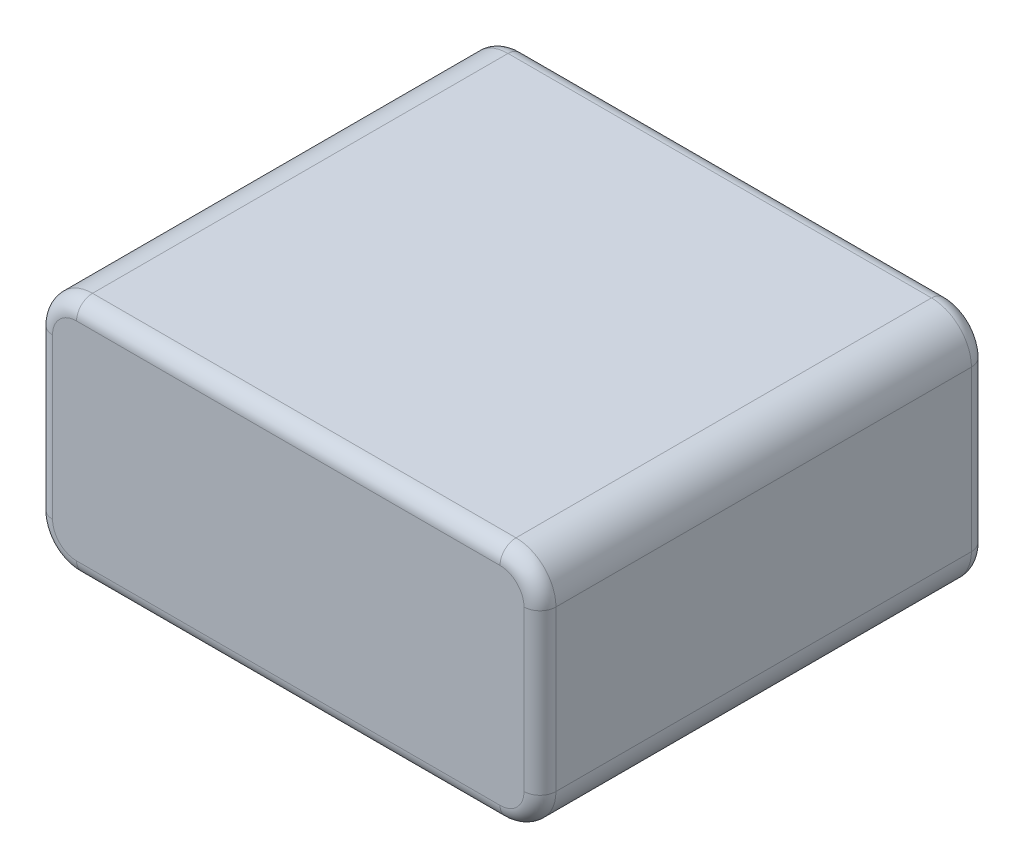
ISO-10303-21;
HEADER;
FILE_DESCRIPTION(('STEP AP214'),'2;1');
FILE_NAME('part.step','',(''),(''),'','','');
FILE_SCHEMA(('AUTOMOTIVE_DESIGN { 1 0 10303 214 1 1 1 1 }'));
ENDSEC;
DATA;
#1=APPLICATION_CONTEXT('core data for automotive mechanical design processes');
#2=APPLICATION_PROTOCOL_DEFINITION('international standard','automotive_design',2000,#1);
#3=PRODUCT_CONTEXT('',#1,'mechanical');
#4=PRODUCT('Part','Part','',(#3));
#5=PRODUCT_RELATED_PRODUCT_CATEGORY('part','',(#4));
#6=PRODUCT_DEFINITION_FORMATION('','',#4);
#7=PRODUCT_DEFINITION_CONTEXT('part definition',#1,'design');
#8=PRODUCT_DEFINITION('design','',#6,#7);
#9=PRODUCT_DEFINITION_SHAPE('','',#8);
#10=(LENGTH_UNIT() NAMED_UNIT(*) SI_UNIT(.MILLI.,.METRE.));
#11=(NAMED_UNIT(*) PLANE_ANGLE_UNIT() SI_UNIT($,.RADIAN.));
#12=(NAMED_UNIT(*) SI_UNIT($,.STERADIAN.) SOLID_ANGLE_UNIT());
#13=UNCERTAINTY_MEASURE_WITH_UNIT(LENGTH_MEASURE(1.E-05),#10,'distance_accuracy_value','');
#14=(GEOMETRIC_REPRESENTATION_CONTEXT(3) GLOBAL_UNCERTAINTY_ASSIGNED_CONTEXT((#13)) GLOBAL_UNIT_ASSIGNED_CONTEXT((#10,
#11,#12)) REPRESENTATION_CONTEXT('',''));
#15=CARTESIAN_POINT('',(0.,0.,0.));
#16=DIRECTION('',(0.,0.,1.));
#17=DIRECTION('',(1.,0.,0.));
#18=AXIS2_PLACEMENT_3D('',#15,#16,#17);
#19=CARTESIAN_POINT('',(-31.5,30.,28.));
#20=DIRECTION('',(1.,0.,0.));
#21=DIRECTION('',(0.,0.,-1.));
#22=AXIS2_PLACEMENT_3D('',#19,#20,#21);
#23=PLANE('',#22);
#24=DIRECTION('',(0.,0.,1.));
#25=VECTOR('',#24,1.);
#26=CARTESIAN_POINT('',(-31.5,25.,-28.));
#27=LINE('',#26,#25);
#28=CARTESIAN_POINT('',(-31.5,25.,26.));
#29=VERTEX_POINT('',#28);
#30=CARTESIAN_POINT('',(-31.5,25.,-26.));
#31=VERTEX_POINT('',#30);
#32=EDGE_CURVE('E285',#29,#31,#27,.F.);
#33=ORIENTED_EDGE('',*,*,#32,.T.);
#34=DIRECTION('',(0.,-1.,0.));
#35=VECTOR('',#34,1.);
#36=CARTESIAN_POINT('',(-31.5,30.,-26.));
#37=LINE('',#36,#35);
#38=CARTESIAN_POINT('',(-31.5,5.,-26.));
#39=VERTEX_POINT('',#38);
#40=EDGE_CURVE('E227',#31,#39,#37,.T.);
#41=ORIENTED_EDGE('',*,*,#40,.T.);
#42=DIRECTION('',(0.,0.,1.));
#43=VECTOR('',#42,1.);
#44=CARTESIAN_POINT('',(-31.5,5.,28.));
#45=LINE('',#44,#43);
#46=CARTESIAN_POINT('',(-31.5,5.,26.));
#47=VERTEX_POINT('',#46);
#48=EDGE_CURVE('E338',#39,#47,#45,.T.);
#49=ORIENTED_EDGE('',*,*,#48,.T.);
#50=DIRECTION('',(0.,-1.,0.));
#51=VECTOR('',#50,1.);
#52=CARTESIAN_POINT('',(-31.5,30.,26.));
#53=LINE('',#52,#51);
#54=EDGE_CURVE('E224',#47,#29,#53,.F.);
#55=ORIENTED_EDGE('',*,*,#54,.T.);
#56=EDGE_LOOP('',(#33,#41,#49,#55));
#57=FACE_BOUND('',#56,.T.);
#58=ADVANCED_FACE('F45',(#57),#23,.F.);
#59=CARTESIAN_POINT('',(31.5,30.,28.));
#60=DIRECTION('',(0.,0.,-1.));
#61=DIRECTION('',(-1.,0.,0.));
#62=AXIS2_PLACEMENT_3D('',#59,#60,#61);
#63=PLANE('',#62);
#64=DIRECTION('',(1.,0.,0.));
#65=VECTOR('',#64,1.);
#66=CARTESIAN_POINT('',(-26.5,28.,28.));
#67=LINE('',#66,#65);
#68=CARTESIAN_POINT('',(26.5,28.,28.));
#69=VERTEX_POINT('',#68);
#70=CARTESIAN_POINT('',(-26.5,28.,28.));
#71=VERTEX_POINT('',#70);
#72=EDGE_CURVE('E55',#69,#71,#67,.F.);
#73=ORIENTED_EDGE('',*,*,#72,.T.);
#74=CARTESIAN_POINT('',(-26.5,25.,28.));
#75=DIRECTION('',(0.,0.,-1.));
#76=DIRECTION('',(-1.,0.,0.));
#77=AXIS2_PLACEMENT_3D('',#74,#75,#76);
#78=CIRCLE('',#77,3.);
#79=CARTESIAN_POINT('',(-29.5,25.,28.));
#80=VERTEX_POINT('',#79);
#81=EDGE_CURVE('E11',#71,#80,#78,.F.);
#82=ORIENTED_EDGE('',*,*,#81,.T.);
#83=DIRECTION('',(0.,-1.,0.));
#84=VECTOR('',#83,1.);
#85=CARTESIAN_POINT('',(-29.5,30.,28.));
#86=LINE('',#85,#84);
#87=CARTESIAN_POINT('',(-29.5,5.,28.));
#88=VERTEX_POINT('',#87);
#89=EDGE_CURVE('E242',#80,#88,#86,.T.);
#90=ORIENTED_EDGE('',*,*,#89,.T.);
#91=CARTESIAN_POINT('',(-26.5,5.,28.));
#92=DIRECTION('',(0.,0.,-1.));
#93=DIRECTION('',(-1.,0.,0.));
#94=AXIS2_PLACEMENT_3D('',#91,#92,#93);
#95=CIRCLE('',#94,3.);
#96=CARTESIAN_POINT('',(-26.5,2.,28.));
#97=VERTEX_POINT('',#96);
#98=EDGE_CURVE('E245',#88,#97,#95,.F.);
#99=ORIENTED_EDGE('',*,*,#98,.T.);
#100=DIRECTION('',(1.,0.,0.));
#101=VECTOR('',#100,1.);
#102=CARTESIAN_POINT('',(31.5,2.,28.));
#103=LINE('',#102,#101);
#104=CARTESIAN_POINT('',(26.5,2.,28.));
#105=VERTEX_POINT('',#104);
#106=EDGE_CURVE('E248',#97,#105,#103,.T.);
#107=ORIENTED_EDGE('',*,*,#106,.T.);
#108=CARTESIAN_POINT('',(26.5,5.,28.));
#109=DIRECTION('',(0.,0.,-1.));
#110=DIRECTION('',(-1.,0.,0.));
#111=AXIS2_PLACEMENT_3D('',#108,#109,#110);
#112=CIRCLE('',#111,3.);
#113=CARTESIAN_POINT('',(29.5,5.,28.));
#114=VERTEX_POINT('',#113);
#115=EDGE_CURVE('E251',#105,#114,#112,.F.);
#116=ORIENTED_EDGE('',*,*,#115,.T.);
#117=DIRECTION('',(0.,-1.,0.));
#118=VECTOR('',#117,1.);
#119=CARTESIAN_POINT('',(29.5,30.,28.));
#120=LINE('',#119,#118);
#121=CARTESIAN_POINT('',(29.5,25.,28.));
#122=VERTEX_POINT('',#121);
#123=EDGE_CURVE('E254',#114,#122,#120,.F.);
#124=ORIENTED_EDGE('',*,*,#123,.T.);
#125=CARTESIAN_POINT('',(26.5,25.,28.));
#126=DIRECTION('',(0.,0.,-1.));
#127=DIRECTION('',(-1.,0.,0.));
#128=AXIS2_PLACEMENT_3D('',#125,#126,#127);
#129=CIRCLE('',#128,3.);
#130=EDGE_CURVE('E66',#122,#69,#129,.F.);
#131=ORIENTED_EDGE('',*,*,#130,.T.);
#132=EDGE_LOOP('',(#73,#82,#90,#99,#107,#116,#124,#131));
#133=FACE_BOUND('',#132,.T.);
#134=ADVANCED_FACE('F400',(#133),#63,.F.);
#135=CARTESIAN_POINT('',(31.5,30.,28.));
#136=DIRECTION('',(-1.,0.,0.));
#137=DIRECTION('',(0.,0.,1.));
#138=AXIS2_PLACEMENT_3D('',#135,#136,#137);
#139=PLANE('',#138);
#140=DIRECTION('',(0.,0.,-1.));
#141=VECTOR('',#140,1.);
#142=CARTESIAN_POINT('',(31.5,5.,28.));
#143=LINE('',#142,#141);
#144=CARTESIAN_POINT('',(31.5,5.,26.));
#145=VERTEX_POINT('',#144);
#146=CARTESIAN_POINT('',(31.5,5.,-26.));
#147=VERTEX_POINT('',#146);
#148=EDGE_CURVE('E181',#145,#147,#143,.T.);
#149=ORIENTED_EDGE('',*,*,#148,.T.);
#150=DIRECTION('',(0.,-1.,0.));
#151=VECTOR('',#150,1.);
#152=CARTESIAN_POINT('',(31.5,30.,-26.));
#153=LINE('',#152,#151);
#154=CARTESIAN_POINT('',(31.5,25.,-26.));
#155=VERTEX_POINT('',#154);
#156=EDGE_CURVE('E202',#147,#155,#153,.F.);
#157=ORIENTED_EDGE('',*,*,#156,.T.);
#158=DIRECTION('',(0.,0.,-1.));
#159=VECTOR('',#158,1.);
#160=CARTESIAN_POINT('',(31.5,25.,28.));
#161=LINE('',#160,#159);
#162=CARTESIAN_POINT('',(31.5,25.,26.));
#163=VERTEX_POINT('',#162);
#164=EDGE_CURVE('E355',#155,#163,#161,.F.);
#165=ORIENTED_EDGE('',*,*,#164,.T.);
#166=DIRECTION('',(0.,-1.,0.));
#167=VECTOR('',#166,1.);
#168=CARTESIAN_POINT('',(31.5,30.,26.));
#169=LINE('',#168,#167);
#170=EDGE_CURVE('E199',#163,#145,#169,.T.);
#171=ORIENTED_EDGE('',*,*,#170,.T.);
#172=EDGE_LOOP('',(#149,#157,#165,#171));
#173=FACE_BOUND('',#172,.T.);
#174=ADVANCED_FACE('F384',(#173),#139,.F.);
#175=CARTESIAN_POINT('',(31.5,30.,-28.));
#176=DIRECTION('',(0.,0.,1.));
#177=DIRECTION('',(1.,0.,0.));
#178=AXIS2_PLACEMENT_3D('',#175,#176,#177);
#179=PLANE('',#178);
#180=DIRECTION('',(0.,-1.,0.));
#181=VECTOR('',#180,1.);
#182=CARTESIAN_POINT('',(29.5,30.,-28.));
#183=LINE('',#182,#181);
#184=CARTESIAN_POINT('',(29.5,25.,-28.));
#185=VERTEX_POINT('',#184);
#186=CARTESIAN_POINT('',(29.5,5.,-28.));
#187=VERTEX_POINT('',#186);
#188=EDGE_CURVE('E185',#185,#187,#183,.T.);
#189=ORIENTED_EDGE('',*,*,#188,.T.);
#190=CARTESIAN_POINT('',(26.5,5.,-28.));
#191=DIRECTION('',(0.,0.,1.));
#192=DIRECTION('',(1.,0.,0.));
#193=AXIS2_PLACEMENT_3D('',#190,#191,#192);
#194=CIRCLE('',#193,3.);
#195=CARTESIAN_POINT('',(26.5,2.,-28.));
#196=VERTEX_POINT('',#195);
#197=EDGE_CURVE('E164',#187,#196,#194,.F.);
#198=ORIENTED_EDGE('',*,*,#197,.T.);
#199=DIRECTION('',(-1.,0.,0.));
#200=VECTOR('',#199,1.);
#201=CARTESIAN_POINT('',(31.5,2.,-28.));
#202=LINE('',#201,#200);
#203=CARTESIAN_POINT('',(-26.5,2.,-28.));
#204=VERTEX_POINT('',#203);
#205=EDGE_CURVE('E173',#196,#204,#202,.T.);
#206=ORIENTED_EDGE('',*,*,#205,.T.);
#207=CARTESIAN_POINT('',(-26.5,5.,-28.));
#208=DIRECTION('',(0.,0.,1.));
#209=DIRECTION('',(1.,0.,0.));
#210=AXIS2_PLACEMENT_3D('',#207,#208,#209);
#211=CIRCLE('',#210,3.);
#212=CARTESIAN_POINT('',(-29.5,5.,-28.));
#213=VERTEX_POINT('',#212);
#214=EDGE_CURVE('E180',#204,#213,#211,.F.);
#215=ORIENTED_EDGE('',*,*,#214,.T.);
#216=DIRECTION('',(0.,-1.,0.));
#217=VECTOR('',#216,1.);
#218=CARTESIAN_POINT('',(-29.5,30.,-28.));
#219=LINE('',#218,#217);
#220=CARTESIAN_POINT('',(-29.5,25.,-28.));
#221=VERTEX_POINT('',#220);
#222=EDGE_CURVE('E363',#213,#221,#219,.F.);
#223=ORIENTED_EDGE('',*,*,#222,.T.);
#224=CARTESIAN_POINT('',(-26.5,25.,-28.));
#225=DIRECTION('',(0.,0.,1.));
#226=DIRECTION('',(1.,0.,0.));
#227=AXIS2_PLACEMENT_3D('',#224,#225,#226);
#228=CIRCLE('',#227,3.);
#229=CARTESIAN_POINT('',(-26.5,28.,-28.));
#230=VERTEX_POINT('',#229);
#231=EDGE_CURVE('E366',#221,#230,#228,.F.);
#232=ORIENTED_EDGE('',*,*,#231,.T.);
#233=DIRECTION('',(-1.,0.,0.));
#234=VECTOR('',#233,1.);
#235=CARTESIAN_POINT('',(26.5,28.,-28.));
#236=LINE('',#235,#234);
#237=CARTESIAN_POINT('',(26.5,28.,-28.));
#238=VERTEX_POINT('',#237);
#239=EDGE_CURVE('E369',#230,#238,#236,.F.);
#240=ORIENTED_EDGE('',*,*,#239,.T.);
#241=CARTESIAN_POINT('',(26.5,25.,-28.));
#242=DIRECTION('',(0.,0.,1.));
#243=DIRECTION('',(1.,0.,0.));
#244=AXIS2_PLACEMENT_3D('',#241,#242,#243);
#245=CIRCLE('',#244,3.);
#246=EDGE_CURVE('E193',#238,#185,#245,.F.);
#247=ORIENTED_EDGE('',*,*,#246,.T.);
#248=EDGE_LOOP('',(#189,#198,#206,#215,#223,#232,#240,#247));
#249=FACE_BOUND('',#248,.T.);
#250=ADVANCED_FACE('F183',(#249),#179,.F.);
#251=CARTESIAN_POINT('',(0.,30.,0.));
#252=DIRECTION('',(0.,1.,0.));
#253=DIRECTION('',(0.,0.,1.));
#254=AXIS2_PLACEMENT_3D('',#251,#252,#253);
#255=PLANE('',#254);
#256=DIRECTION('',(0.,0.,-1.));
#257=VECTOR('',#256,1.);
#258=CARTESIAN_POINT('',(26.5,30.,-28.));
#259=LINE('',#258,#257);
#260=CARTESIAN_POINT('',(26.5,30.,26.));
#261=VERTEX_POINT('',#260);
#262=CARTESIAN_POINT('',(26.5,30.,-26.));
#263=VERTEX_POINT('',#262);
#264=EDGE_CURVE('E342',#261,#263,#259,.T.);
#265=ORIENTED_EDGE('',*,*,#264,.T.);
#266=DIRECTION('',(-1.,0.,0.));
#267=VECTOR('',#266,1.);
#268=CARTESIAN_POINT('',(-26.5,30.,-26.));
#269=LINE('',#268,#267);
#270=CARTESIAN_POINT('',(-26.5,30.,-26.));
#271=VERTEX_POINT('',#270);
#272=EDGE_CURVE('E214',#263,#271,#269,.T.);
#273=ORIENTED_EDGE('',*,*,#272,.T.);
#274=DIRECTION('',(0.,0.,1.));
#275=VECTOR('',#274,1.);
#276=CARTESIAN_POINT('',(-26.5,30.,28.));
#277=LINE('',#276,#275);
#278=CARTESIAN_POINT('',(-26.5,30.,26.));
#279=VERTEX_POINT('',#278);
#280=EDGE_CURVE('E351',#271,#279,#277,.T.);
#281=ORIENTED_EDGE('',*,*,#280,.T.);
#282=DIRECTION('',(1.,0.,0.));
#283=VECTOR('',#282,1.);
#284=CARTESIAN_POINT('',(26.5,30.,26.));
#285=LINE('',#284,#283);
#286=EDGE_CURVE('E211',#279,#261,#285,.T.);
#287=ORIENTED_EDGE('',*,*,#286,.T.);
#288=EDGE_LOOP('',(#265,#273,#281,#287));
#289=FACE_BOUND('',#288,.T.);
#290=ADVANCED_FACE('F429',(#289),#255,.T.);
#291=CARTESIAN_POINT('',(0.,0.,0.));
#292=DIRECTION('',(0.,1.,0.));
#293=DIRECTION('',(0.,0.,1.));
#294=AXIS2_PLACEMENT_3D('',#291,#292,#293);
#295=PLANE('',#294);
#296=DIRECTION('',(0.,0.,1.));
#297=VECTOR('',#296,1.);
#298=CARTESIAN_POINT('',(-26.5,0.,0.));
#299=LINE('',#298,#297);
#300=CARTESIAN_POINT('',(-26.5,0.,26.));
#301=VERTEX_POINT('',#300);
#302=CARTESIAN_POINT('',(-26.5,0.,-26.));
#303=VERTEX_POINT('',#302);
#304=EDGE_CURVE('E337',#301,#303,#299,.F.);
#305=ORIENTED_EDGE('',*,*,#304,.T.);
#306=DIRECTION('',(-1.,0.,0.));
#307=VECTOR('',#306,1.);
#308=CARTESIAN_POINT('',(0.,0.,-26.));
#309=LINE('',#308,#307);
#310=CARTESIAN_POINT('',(26.5,0.,-26.));
#311=VERTEX_POINT('',#310);
#312=EDGE_CURVE('E239',#303,#311,#309,.F.);
#313=ORIENTED_EDGE('',*,*,#312,.T.);
#314=DIRECTION('',(0.,0.,-1.));
#315=VECTOR('',#314,1.);
#316=CARTESIAN_POINT('',(26.5,0.,0.));
#317=LINE('',#316,#315);
#318=CARTESIAN_POINT('',(26.5,0.,26.));
#319=VERTEX_POINT('',#318);
#320=EDGE_CURVE('E330',#311,#319,#317,.F.);
#321=ORIENTED_EDGE('',*,*,#320,.T.);
#322=DIRECTION('',(1.,0.,0.));
#323=VECTOR('',#322,1.);
#324=CARTESIAN_POINT('',(0.,0.,26.));
#325=LINE('',#324,#323);
#326=EDGE_CURVE('E236',#319,#301,#325,.F.);
#327=ORIENTED_EDGE('',*,*,#326,.T.);
#328=EDGE_LOOP('',(#305,#313,#321,#327));
#329=FACE_BOUND('',#328,.T.);
#330=ADVANCED_FACE('F334',(#329),#295,.F.);
#331=CARTESIAN_POINT('',(-26.5,5.,28.));
#332=DIRECTION('',(0.,0.,1.));
#333=DIRECTION('',(1.,0.,0.));
#334=AXIS2_PLACEMENT_3D('',#331,#332,#333);
#335=CYLINDRICAL_SURFACE('',#334,5.);
#336=ORIENTED_EDGE('',*,*,#48,.F.);
#337=CARTESIAN_POINT('',(-26.5,5.,-26.));
#338=DIRECTION('',(0.,0.,1.));
#339=DIRECTION('',(1.,0.,0.));
#340=AXIS2_PLACEMENT_3D('',#337,#338,#339);
#341=CIRCLE('',#340,5.);
#342=EDGE_CURVE('E233',#39,#303,#341,.T.);
#343=ORIENTED_EDGE('',*,*,#342,.T.);
#344=ORIENTED_EDGE('',*,*,#304,.F.);
#345=CARTESIAN_POINT('',(-26.5,5.,26.));
#346=DIRECTION('',(0.,0.,-1.));
#347=DIRECTION('',(-1.,0.,0.));
#348=AXIS2_PLACEMENT_3D('',#345,#346,#347);
#349=CIRCLE('',#348,5.);
#350=EDGE_CURVE('E230',#301,#47,#349,.T.);
#351=ORIENTED_EDGE('',*,*,#350,.T.);
#352=EDGE_LOOP('',(#336,#343,#344,#351));
#353=FACE_BOUND('',#352,.T.);
#354=ADVANCED_FACE('F436',(#353),#335,.T.);
#355=CARTESIAN_POINT('',(-26.5,25.,0.));
#356=DIRECTION('',(0.,0.,-1.));
#357=DIRECTION('',(-1.,0.,0.));
#358=AXIS2_PLACEMENT_3D('',#355,#356,#357);
#359=CYLINDRICAL_SURFACE('',#358,5.);
#360=ORIENTED_EDGE('',*,*,#280,.F.);
#361=CARTESIAN_POINT('',(-26.5,25.,-26.));
#362=DIRECTION('',(0.,0.,1.));
#363=DIRECTION('',(1.,0.,0.));
#364=AXIS2_PLACEMENT_3D('',#361,#362,#363);
#365=CIRCLE('',#364,5.);
#366=EDGE_CURVE('E221',#271,#31,#365,.T.);
#367=ORIENTED_EDGE('',*,*,#366,.T.);
#368=ORIENTED_EDGE('',*,*,#32,.F.);
#369=CARTESIAN_POINT('',(-26.5,25.,26.));
#370=DIRECTION('',(0.,0.,-1.));
#371=DIRECTION('',(-1.,0.,0.));
#372=AXIS2_PLACEMENT_3D('',#369,#370,#371);
#373=CIRCLE('',#372,5.);
#374=EDGE_CURVE('E217',#29,#279,#373,.T.);
#375=ORIENTED_EDGE('',*,*,#374,.T.);
#376=EDGE_LOOP('',(#360,#367,#368,#375));
#377=FACE_BOUND('',#376,.T.);
#378=ADVANCED_FACE('F417',(#377),#359,.T.);
#379=CARTESIAN_POINT('',(26.5,5.,28.));
#380=DIRECTION('',(0.,0.,-1.));
#381=DIRECTION('',(-1.,0.,0.));
#382=AXIS2_PLACEMENT_3D('',#379,#380,#381);
#383=CYLINDRICAL_SURFACE('',#382,5.);
#384=ORIENTED_EDGE('',*,*,#320,.F.);
#385=CARTESIAN_POINT('',(26.5,5.,-26.));
#386=DIRECTION('',(0.,0.,1.));
#387=DIRECTION('',(1.,0.,0.));
#388=AXIS2_PLACEMENT_3D('',#385,#386,#387);
#389=CIRCLE('',#388,5.);
#390=EDGE_CURVE('E166',#311,#147,#389,.T.);
#391=ORIENTED_EDGE('',*,*,#390,.T.);
#392=ORIENTED_EDGE('',*,*,#148,.F.);
#393=CARTESIAN_POINT('',(26.5,5.,26.));
#394=DIRECTION('',(0.,0.,-1.));
#395=DIRECTION('',(-1.,0.,0.));
#396=AXIS2_PLACEMENT_3D('',#393,#394,#395);
#397=CIRCLE('',#396,5.);
#398=EDGE_CURVE('E188',#145,#319,#397,.T.);
#399=ORIENTED_EDGE('',*,*,#398,.T.);
#400=EDGE_LOOP('',(#384,#391,#392,#399));
#401=FACE_BOUND('',#400,.T.);
#402=ADVANCED_FACE('F329',(#401),#383,.T.);
#403=CARTESIAN_POINT('',(26.5,25.,0.));
#404=DIRECTION('',(0.,0.,1.));
#405=DIRECTION('',(1.,0.,0.));
#406=AXIS2_PLACEMENT_3D('',#403,#404,#405);
#407=CYLINDRICAL_SURFACE('',#406,5.);
#408=ORIENTED_EDGE('',*,*,#164,.F.);
#409=CARTESIAN_POINT('',(26.5,25.,-26.));
#410=DIRECTION('',(0.,0.,1.));
#411=DIRECTION('',(1.,0.,0.));
#412=AXIS2_PLACEMENT_3D('',#409,#410,#411);
#413=CIRCLE('',#412,5.);
#414=EDGE_CURVE('E208',#155,#263,#413,.T.);
#415=ORIENTED_EDGE('',*,*,#414,.T.);
#416=ORIENTED_EDGE('',*,*,#264,.F.);
#417=CARTESIAN_POINT('',(26.5,25.,26.));
#418=DIRECTION('',(0.,0.,-1.));
#419=DIRECTION('',(-1.,0.,0.));
#420=AXIS2_PLACEMENT_3D('',#417,#418,#419);
#421=CIRCLE('',#420,5.);
#422=EDGE_CURVE('E205',#261,#163,#421,.T.);
#423=ORIENTED_EDGE('',*,*,#422,.T.);
#424=EDGE_LOOP('',(#408,#415,#416,#423));
#425=FACE_BOUND('',#424,.T.);
#426=ADVANCED_FACE('F386',(#425),#407,.T.);
#427=CARTESIAN_POINT('',(-26.5,25.,-26.));
#428=DIRECTION('',(0.,0.,1.));
#429=DIRECTION('',(1.,0.,0.));
#430=AXIS2_PLACEMENT_3D('',#427,#428,#429);
#431=TOROIDAL_SURFACE('',#430,3.,2.);
#432=CARTESIAN_POINT('',(-29.5,25.,-26.));
#433=DIRECTION('',(0.,-1.,0.));
#434=DIRECTION('',(0.,0.,-1.));
#435=AXIS2_PLACEMENT_3D('',#432,#433,#434);
#436=CIRCLE('',#435,2.);
#437=EDGE_CURVE('E277',#31,#221,#436,.T.);
#438=ORIENTED_EDGE('',*,*,#437,.F.);
#439=ORIENTED_EDGE('',*,*,#366,.F.);
#440=CARTESIAN_POINT('',(-26.5,28.,-26.));
#441=DIRECTION('',(1.,0.,0.));
#442=DIRECTION('',(0.,0.,-1.));
#443=AXIS2_PLACEMENT_3D('',#440,#441,#442);
#444=CIRCLE('',#443,2.);
#445=EDGE_CURVE('E281',#230,#271,#444,.T.);
#446=ORIENTED_EDGE('',*,*,#445,.F.);
#447=ORIENTED_EDGE('',*,*,#231,.F.);
#448=EDGE_LOOP('',(#438,#439,#446,#447));
#449=FACE_BOUND('',#448,.T.);
#450=ADVANCED_FACE('F422',(#449),#431,.T.);
#451=CARTESIAN_POINT('',(0.,28.,-26.));
#452=DIRECTION('',(1.,0.,0.));
#453=DIRECTION('',(0.,0.,-1.));
#454=AXIS2_PLACEMENT_3D('',#451,#452,#453);
#455=CYLINDRICAL_SURFACE('',#454,2.);
#456=ORIENTED_EDGE('',*,*,#445,.T.);
#457=ORIENTED_EDGE('',*,*,#272,.F.);
#458=CARTESIAN_POINT('',(26.5,28.,-26.));
#459=DIRECTION('',(1.,0.,0.));
#460=DIRECTION('',(0.,0.,-1.));
#461=AXIS2_PLACEMENT_3D('',#458,#459,#460);
#462=CIRCLE('',#461,2.);
#463=EDGE_CURVE('E273',#238,#263,#462,.T.);
#464=ORIENTED_EDGE('',*,*,#463,.F.);
#465=ORIENTED_EDGE('',*,*,#239,.F.);
#466=EDGE_LOOP('',(#456,#457,#464,#465));
#467=FACE_BOUND('',#466,.T.);
#468=ADVANCED_FACE('F427',(#467),#455,.T.);
#469=CARTESIAN_POINT('',(-29.5,30.,-26.));
#470=DIRECTION('',(0.,-1.,0.));
#471=DIRECTION('',(0.,0.,-1.));
#472=AXIS2_PLACEMENT_3D('',#469,#470,#471);
#473=CYLINDRICAL_SURFACE('',#472,2.);
#474=ORIENTED_EDGE('',*,*,#437,.T.);
#475=ORIENTED_EDGE('',*,*,#222,.F.);
#476=CARTESIAN_POINT('',(-29.5,5.,-26.));
#477=DIRECTION('',(0.,-1.,0.));
#478=DIRECTION('',(0.,0.,-1.));
#479=AXIS2_PLACEMENT_3D('',#476,#477,#478);
#480=CIRCLE('',#479,2.);
#481=EDGE_CURVE('E269',#39,#213,#480,.T.);
#482=ORIENTED_EDGE('',*,*,#481,.F.);
#483=ORIENTED_EDGE('',*,*,#40,.F.);
#484=EDGE_LOOP('',(#474,#475,#482,#483));
#485=FACE_BOUND('',#484,.T.);
#486=ADVANCED_FACE('F468',(#485),#473,.T.);
#487=CARTESIAN_POINT('',(26.5,25.,-26.));
#488=DIRECTION('',(0.,0.,1.));
#489=DIRECTION('',(1.,0.,0.));
#490=AXIS2_PLACEMENT_3D('',#487,#488,#489);
#491=TOROIDAL_SURFACE('',#490,3.,2.);
#492=ORIENTED_EDGE('',*,*,#463,.T.);
#493=ORIENTED_EDGE('',*,*,#414,.F.);
#494=CARTESIAN_POINT('',(29.5,25.,-26.));
#495=DIRECTION('',(0.,-1.,0.));
#496=DIRECTION('',(0.,0.,-1.));
#497=AXIS2_PLACEMENT_3D('',#494,#495,#496);
#498=CIRCLE('',#497,2.);
#499=EDGE_CURVE('E265',#185,#155,#498,.T.);
#500=ORIENTED_EDGE('',*,*,#499,.F.);
#501=ORIENTED_EDGE('',*,*,#246,.F.);
#502=EDGE_LOOP('',(#492,#493,#500,#501));
#503=FACE_BOUND('',#502,.T.);
#504=ADVANCED_FACE('F378',(#503),#491,.T.);
#505=CARTESIAN_POINT('',(-26.5,5.,-26.));
#506=DIRECTION('',(0.,0.,1.));
#507=DIRECTION('',(1.,0.,0.));
#508=AXIS2_PLACEMENT_3D('',#505,#506,#507);
#509=TOROIDAL_SURFACE('',#508,3.,2.);
#510=ORIENTED_EDGE('',*,*,#481,.T.);
#511=ORIENTED_EDGE('',*,*,#214,.F.);
#512=CARTESIAN_POINT('',(-26.5,2.,-26.));
#513=DIRECTION('',(1.,0.,0.));
#514=DIRECTION('',(0.,0.,-1.));
#515=AXIS2_PLACEMENT_3D('',#512,#513,#514);
#516=CIRCLE('',#515,2.);
#517=EDGE_CURVE('E176',#303,#204,#516,.T.);
#518=ORIENTED_EDGE('',*,*,#517,.F.);
#519=ORIENTED_EDGE('',*,*,#342,.F.);
#520=EDGE_LOOP('',(#510,#511,#518,#519));
#521=FACE_BOUND('',#520,.T.);
#522=ADVANCED_FACE('F462',(#521),#509,.T.);
#523=CARTESIAN_POINT('',(29.5,30.,-26.));
#524=DIRECTION('',(0.,-1.,0.));
#525=DIRECTION('',(0.,0.,-1.));
#526=AXIS2_PLACEMENT_3D('',#523,#524,#525);
#527=CYLINDRICAL_SURFACE('',#526,2.);
#528=ORIENTED_EDGE('',*,*,#499,.T.);
#529=ORIENTED_EDGE('',*,*,#156,.F.);
#530=CARTESIAN_POINT('',(29.5,5.,-26.));
#531=DIRECTION('',(0.,-1.,0.));
#532=DIRECTION('',(0.,0.,-1.));
#533=AXIS2_PLACEMENT_3D('',#530,#531,#532);
#534=CIRCLE('',#533,2.);
#535=EDGE_CURVE('E170',#187,#147,#534,.T.);
#536=ORIENTED_EDGE('',*,*,#535,.F.);
#537=ORIENTED_EDGE('',*,*,#188,.F.);
#538=EDGE_LOOP('',(#528,#529,#536,#537));
#539=FACE_BOUND('',#538,.T.);
#540=ADVANCED_FACE('F381',(#539),#527,.T.);
#541=CARTESIAN_POINT('',(31.5,2.,-26.));
#542=DIRECTION('',(-1.,0.,0.));
#543=DIRECTION('',(0.,0.,1.));
#544=AXIS2_PLACEMENT_3D('',#541,#542,#543);
#545=CYLINDRICAL_SURFACE('',#544,2.);
#546=ORIENTED_EDGE('',*,*,#517,.T.);
#547=ORIENTED_EDGE('',*,*,#205,.F.);
#548=CARTESIAN_POINT('',(26.5,2.,-26.));
#549=DIRECTION('',(1.,0.,0.));
#550=DIRECTION('',(0.,0.,-1.));
#551=AXIS2_PLACEMENT_3D('',#548,#549,#550);
#552=CIRCLE('',#551,2.);
#553=EDGE_CURVE('E160',#311,#196,#552,.T.);
#554=ORIENTED_EDGE('',*,*,#553,.F.);
#555=ORIENTED_EDGE('',*,*,#312,.F.);
#556=EDGE_LOOP('',(#546,#547,#554,#555));
#557=FACE_BOUND('',#556,.T.);
#558=ADVANCED_FACE('F174',(#557),#545,.T.);
#559=CARTESIAN_POINT('',(26.5,5.,-26.));
#560=DIRECTION('',(0.,0.,1.));
#561=DIRECTION('',(1.,0.,0.));
#562=AXIS2_PLACEMENT_3D('',#559,#560,#561);
#563=TOROIDAL_SURFACE('',#562,3.,2.);
#564=ORIENTED_EDGE('',*,*,#535,.T.);
#565=ORIENTED_EDGE('',*,*,#390,.F.);
#566=ORIENTED_EDGE('',*,*,#553,.T.);
#567=ORIENTED_EDGE('',*,*,#197,.F.);
#568=EDGE_LOOP('',(#564,#565,#566,#567));
#569=FACE_BOUND('',#568,.T.);
#570=ADVANCED_FACE('F162',(#569),#563,.T.);
#571=CARTESIAN_POINT('',(26.5,5.,26.));
#572=DIRECTION('',(0.,0.,-1.));
#573=DIRECTION('',(-1.,0.,0.));
#574=AXIS2_PLACEMENT_3D('',#571,#572,#573);
#575=TOROIDAL_SURFACE('',#574,3.,2.);
#576=CARTESIAN_POINT('',(26.5,2.,26.));
#577=DIRECTION('',(-1.,0.,0.));
#578=DIRECTION('',(0.,0.,1.));
#579=AXIS2_PLACEMENT_3D('',#576,#577,#578);
#580=CIRCLE('',#579,2.);
#581=EDGE_CURVE('E307',#319,#105,#580,.T.);
#582=ORIENTED_EDGE('',*,*,#581,.F.);
#583=ORIENTED_EDGE('',*,*,#398,.F.);
#584=CARTESIAN_POINT('',(29.5,5.,26.));
#585=DIRECTION('',(0.,1.,0.));
#586=DIRECTION('',(0.,0.,1.));
#587=AXIS2_PLACEMENT_3D('',#584,#585,#586);
#588=CIRCLE('',#587,2.);
#589=EDGE_CURVE('E49',#114,#145,#588,.T.);
#590=ORIENTED_EDGE('',*,*,#589,.F.);
#591=ORIENTED_EDGE('',*,*,#115,.F.);
#592=EDGE_LOOP('',(#582,#583,#590,#591));
#593=FACE_BOUND('',#592,.T.);
#594=ADVANCED_FACE('F47',(#593),#575,.T.);
#595=CARTESIAN_POINT('',(29.5,30.,26.));
#596=DIRECTION('',(0.,-1.,0.));
#597=DIRECTION('',(0.,0.,-1.));
#598=AXIS2_PLACEMENT_3D('',#595,#596,#597);
#599=CYLINDRICAL_SURFACE('',#598,2.);
#600=ORIENTED_EDGE('',*,*,#589,.T.);
#601=ORIENTED_EDGE('',*,*,#170,.F.);
#602=CARTESIAN_POINT('',(29.5,25.,26.));
#603=DIRECTION('',(0.,1.,0.));
#604=DIRECTION('',(0.,0.,1.));
#605=AXIS2_PLACEMENT_3D('',#602,#603,#604);
#606=CIRCLE('',#605,2.);
#607=EDGE_CURVE('E304',#122,#163,#606,.T.);
#608=ORIENTED_EDGE('',*,*,#607,.F.);
#609=ORIENTED_EDGE('',*,*,#123,.F.);
#610=EDGE_LOOP('',(#600,#601,#608,#609));
#611=FACE_BOUND('',#610,.T.);
#612=ADVANCED_FACE('F320',(#611),#599,.T.);
#613=CARTESIAN_POINT('',(31.5,2.,26.));
#614=DIRECTION('',(1.,0.,0.));
#615=DIRECTION('',(0.,0.,-1.));
#616=AXIS2_PLACEMENT_3D('',#613,#614,#615);
#617=CYLINDRICAL_SURFACE('',#616,2.);
#618=ORIENTED_EDGE('',*,*,#581,.T.);
#619=ORIENTED_EDGE('',*,*,#106,.F.);
#620=CARTESIAN_POINT('',(-26.5,2.,26.));
#621=DIRECTION('',(-1.,0.,0.));
#622=DIRECTION('',(0.,0.,1.));
#623=AXIS2_PLACEMENT_3D('',#620,#621,#622);
#624=CIRCLE('',#623,2.);
#625=EDGE_CURVE('E300',#301,#97,#624,.T.);
#626=ORIENTED_EDGE('',*,*,#625,.F.);
#627=ORIENTED_EDGE('',*,*,#326,.F.);
#628=EDGE_LOOP('',(#618,#619,#626,#627));
#629=FACE_BOUND('',#628,.T.);
#630=ADVANCED_FACE('F486',(#629),#617,.T.);
#631=CARTESIAN_POINT('',(26.5,25.,26.));
#632=DIRECTION('',(0.,0.,-1.));
#633=DIRECTION('',(-1.,0.,0.));
#634=AXIS2_PLACEMENT_3D('',#631,#632,#633);
#635=TOROIDAL_SURFACE('',#634,3.,2.);
#636=ORIENTED_EDGE('',*,*,#607,.T.);
#637=ORIENTED_EDGE('',*,*,#422,.F.);
#638=CARTESIAN_POINT('',(26.5,28.,26.));
#639=DIRECTION('',(-1.,0.,0.));
#640=DIRECTION('',(0.,0.,1.));
#641=AXIS2_PLACEMENT_3D('',#638,#639,#640);
#642=CIRCLE('',#641,2.);
#643=EDGE_CURVE('E296',#69,#261,#642,.T.);
#644=ORIENTED_EDGE('',*,*,#643,.F.);
#645=ORIENTED_EDGE('',*,*,#130,.F.);
#646=EDGE_LOOP('',(#636,#637,#644,#645));
#647=FACE_BOUND('',#646,.T.);
#648=ADVANCED_FACE('F390',(#647),#635,.T.);
#649=CARTESIAN_POINT('',(-26.5,5.,26.));
#650=DIRECTION('',(0.,0.,-1.));
#651=DIRECTION('',(-1.,0.,0.));
#652=AXIS2_PLACEMENT_3D('',#649,#650,#651);
#653=TOROIDAL_SURFACE('',#652,3.,2.);
#654=ORIENTED_EDGE('',*,*,#625,.T.);
#655=ORIENTED_EDGE('',*,*,#98,.F.);
#656=CARTESIAN_POINT('',(-29.5,5.,26.));
#657=DIRECTION('',(0.,1.,0.));
#658=DIRECTION('',(0.,0.,1.));
#659=AXIS2_PLACEMENT_3D('',#656,#657,#658);
#660=CIRCLE('',#659,2.);
#661=EDGE_CURVE('E292',#47,#88,#660,.T.);
#662=ORIENTED_EDGE('',*,*,#661,.F.);
#663=ORIENTED_EDGE('',*,*,#350,.F.);
#664=EDGE_LOOP('',(#654,#655,#662,#663));
#665=FACE_BOUND('',#664,.T.);
#666=ADVANCED_FACE('F405',(#665),#653,.T.);
#667=CARTESIAN_POINT('',(0.,28.,26.));
#668=DIRECTION('',(-1.,0.,0.));
#669=DIRECTION('',(0.,0.,1.));
#670=AXIS2_PLACEMENT_3D('',#667,#668,#669);
#671=CYLINDRICAL_SURFACE('',#670,2.);
#672=ORIENTED_EDGE('',*,*,#643,.T.);
#673=ORIENTED_EDGE('',*,*,#286,.F.);
#674=CARTESIAN_POINT('',(-26.5,28.,26.));
#675=DIRECTION('',(-1.,0.,0.));
#676=DIRECTION('',(0.,0.,1.));
#677=AXIS2_PLACEMENT_3D('',#674,#675,#676);
#678=CIRCLE('',#677,2.);
#679=EDGE_CURVE('E289',#71,#279,#678,.T.);
#680=ORIENTED_EDGE('',*,*,#679,.F.);
#681=ORIENTED_EDGE('',*,*,#72,.F.);
#682=EDGE_LOOP('',(#672,#673,#680,#681));
#683=FACE_BOUND('',#682,.T.);
#684=ADVANCED_FACE('F393',(#683),#671,.T.);
#685=CARTESIAN_POINT('',(-29.5,30.,26.));
#686=DIRECTION('',(0.,-1.,0.));
#687=DIRECTION('',(0.,0.,-1.));
#688=AXIS2_PLACEMENT_3D('',#685,#686,#687);
#689=CYLINDRICAL_SURFACE('',#688,2.);
#690=ORIENTED_EDGE('',*,*,#661,.T.);
#691=ORIENTED_EDGE('',*,*,#89,.F.);
#692=CARTESIAN_POINT('',(-29.5,25.,26.));
#693=DIRECTION('',(0.,1.,0.));
#694=DIRECTION('',(0.,0.,1.));
#695=AXIS2_PLACEMENT_3D('',#692,#693,#694);
#696=CIRCLE('',#695,2.);
#697=EDGE_CURVE('E286',#29,#80,#696,.T.);
#698=ORIENTED_EDGE('',*,*,#697,.F.);
#699=ORIENTED_EDGE('',*,*,#54,.F.);
#700=EDGE_LOOP('',(#690,#691,#698,#699));
#701=FACE_BOUND('',#700,.T.);
#702=ADVANCED_FACE('F409',(#701),#689,.T.);
#703=CARTESIAN_POINT('',(-26.5,25.,26.));
#704=DIRECTION('',(0.,0.,-1.));
#705=DIRECTION('',(-1.,0.,0.));
#706=AXIS2_PLACEMENT_3D('',#703,#704,#705);
#707=TOROIDAL_SURFACE('',#706,3.,2.);
#708=ORIENTED_EDGE('',*,*,#679,.T.);
#709=ORIENTED_EDGE('',*,*,#374,.F.);
#710=ORIENTED_EDGE('',*,*,#697,.T.);
#711=ORIENTED_EDGE('',*,*,#81,.F.);
#712=EDGE_LOOP('',(#708,#709,#710,#711));
#713=FACE_BOUND('',#712,.T.);
#714=ADVANCED_FACE('F397',(#713),#707,.T.);
#715=CLOSED_SHELL('',(#58,#134,#174,#250,#290,#330,#354,#378,#402,#426,#450,#468,#486,#504,#522,
#540,#558,#570,#594,#612,#630,#648,#666,#684,#702,#714));
#716=MANIFOLD_SOLID_BREP('B2',#715);
#717=ADVANCED_BREP_SHAPE_REPRESENTATION('',(#18,#716),#14);
#718=SHAPE_DEFINITION_REPRESENTATION(#9,#717);
ENDSEC;
END-ISO-10303-21;
